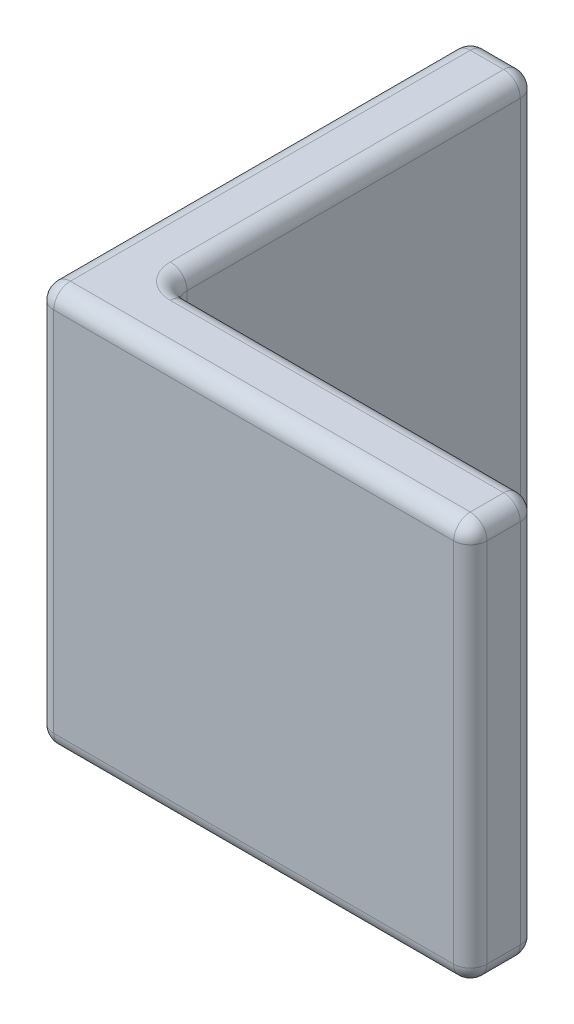
ISO-10303-21;
HEADER;
FILE_DESCRIPTION(('STEP AP214'),'2;1');
FILE_NAME('part.step','',(''),(''),'','','');
FILE_SCHEMA(('AUTOMOTIVE_DESIGN { 1 0 10303 214 1 1 1 1 }'));
ENDSEC;
DATA;
#1=APPLICATION_CONTEXT('core data for automotive mechanical design processes');
#2=APPLICATION_PROTOCOL_DEFINITION('international standard','automotive_design',2000,#1);
#3=PRODUCT_CONTEXT('',#1,'mechanical');
#4=PRODUCT('Part','Part','',(#3));
#5=PRODUCT_RELATED_PRODUCT_CATEGORY('part','',(#4));
#6=PRODUCT_DEFINITION_FORMATION('','',#4);
#7=PRODUCT_DEFINITION_CONTEXT('part definition',#1,'design');
#8=PRODUCT_DEFINITION('design','',#6,#7);
#9=PRODUCT_DEFINITION_SHAPE('','',#8);
#10=(LENGTH_UNIT() NAMED_UNIT(*) SI_UNIT(.MILLI.,.METRE.));
#11=(NAMED_UNIT(*) PLANE_ANGLE_UNIT() SI_UNIT($,.RADIAN.));
#12=(NAMED_UNIT(*) SI_UNIT($,.STERADIAN.) SOLID_ANGLE_UNIT());
#13=UNCERTAINTY_MEASURE_WITH_UNIT(LENGTH_MEASURE(1.E-05),#10,'distance_accuracy_value','');
#14=(GEOMETRIC_REPRESENTATION_CONTEXT(3) GLOBAL_UNCERTAINTY_ASSIGNED_CONTEXT((#13)) GLOBAL_UNIT_ASSIGNED_CONTEXT((#10,
#11,#12)) REPRESENTATION_CONTEXT('',''));
#15=CARTESIAN_POINT('',(0.,0.,0.));
#16=DIRECTION('',(0.,0.,1.));
#17=DIRECTION('',(1.,0.,0.));
#18=AXIS2_PLACEMENT_3D('',#15,#16,#17);
#19=CARTESIAN_POINT('',(0.,1828.8,0.));
#20=DIRECTION('',(1.,0.,0.));
#21=DIRECTION('',(0.,0.,-1.));
#22=AXIS2_PLACEMENT_3D('',#19,#20,#21);
#23=PLANE('',#22);
#24=DIRECTION('',(0.,-1.,0.));
#25=VECTOR('',#24,1.);
#26=CARTESIAN_POINT('',(0.,1828.8,-1905.));
#27=LINE('',#26,#25);
#28=CARTESIAN_POINT('',(0.,1752.6,-1905.));
#29=VERTEX_POINT('',#28);
#30=CARTESIAN_POINT('',(0.,76.2,-1905.));
#31=VERTEX_POINT('',#30);
#32=EDGE_CURVE('E178',#29,#31,#27,.T.);
#33=ORIENTED_EDGE('',*,*,#32,.T.);
#34=DIRECTION('',(0.,0.,1.));
#35=VECTOR('',#34,1.);
#36=CARTESIAN_POINT('',(0.,76.2,0.));
#37=LINE('',#36,#35);
#38=CARTESIAN_POINT('',(0.,76.2,-76.2));
#39=VERTEX_POINT('',#38);
#40=EDGE_CURVE('E174',#31,#39,#37,.T.);
#41=ORIENTED_EDGE('',*,*,#40,.T.);
#42=DIRECTION('',(0.,-1.,0.));
#43=VECTOR('',#42,1.);
#44=CARTESIAN_POINT('',(0.,1828.8,-76.2));
#45=LINE('',#44,#43);
#46=CARTESIAN_POINT('',(0.,1752.6,-76.2));
#47=VERTEX_POINT('',#46);
#48=EDGE_CURVE('E169',#39,#47,#45,.F.);
#49=ORIENTED_EDGE('',*,*,#48,.T.);
#50=DIRECTION('',(0.,0.,1.));
#51=VECTOR('',#50,1.);
#52=CARTESIAN_POINT('',(0.,1752.6,0.));
#53=LINE('',#52,#51);
#54=EDGE_CURVE('E171',#47,#29,#53,.F.);
#55=ORIENTED_EDGE('',*,*,#54,.T.);
#56=EDGE_LOOP('',(#33,#41,#49,#55));
#57=FACE_BOUND('',#56,.T.);
#58=ADVANCED_FACE('F39',(#57),#23,.F.);
#59=CARTESIAN_POINT('',(0.,1828.8,0.));
#60=DIRECTION('',(0.,0.,-1.));
#61=DIRECTION('',(-1.,0.,0.));
#62=AXIS2_PLACEMENT_3D('',#59,#60,#61);
#63=PLANE('',#62);
#64=DIRECTION('',(0.,-1.,0.));
#65=VECTOR('',#64,1.);
#66=CARTESIAN_POINT('',(76.2,1828.8,0.));
#67=LINE('',#66,#65);
#68=CARTESIAN_POINT('',(76.2,1752.6,0.));
#69=VERTEX_POINT('',#68);
#70=CARTESIAN_POINT('',(76.2,76.2,0.));
#71=VERTEX_POINT('',#70);
#72=EDGE_CURVE('E200',#69,#71,#67,.T.);
#73=ORIENTED_EDGE('',*,*,#72,.T.);
#74=DIRECTION('',(1.,0.,0.));
#75=VECTOR('',#74,1.);
#76=CARTESIAN_POINT('',(1981.2,76.2,0.));
#77=LINE('',#76,#75);
#78=CARTESIAN_POINT('',(1905.,76.2,0.));
#79=VERTEX_POINT('',#78);
#80=EDGE_CURVE('E322',#71,#79,#77,.T.);
#81=ORIENTED_EDGE('',*,*,#80,.T.);
#82=DIRECTION('',(0.,-1.,0.));
#83=VECTOR('',#82,1.);
#84=CARTESIAN_POINT('',(1905.,1828.8,0.));
#85=LINE('',#84,#83);
#86=CARTESIAN_POINT('',(1905.,1752.6,0.));
#87=VERTEX_POINT('',#86);
#88=EDGE_CURVE('E319',#79,#87,#85,.F.);
#89=ORIENTED_EDGE('',*,*,#88,.T.);
#90=DIRECTION('',(1.,0.,0.));
#91=VECTOR('',#90,1.);
#92=CARTESIAN_POINT('',(0.,1752.6,0.));
#93=LINE('',#92,#91);
#94=EDGE_CURVE('E317',#87,#69,#93,.F.);
#95=ORIENTED_EDGE('',*,*,#94,.T.);
#96=EDGE_LOOP('',(#73,#81,#89,#95));
#97=FACE_BOUND('',#96,.T.);
#98=ADVANCED_FACE('F452',(#97),#63,.F.);
#99=CARTESIAN_POINT('',(1981.2,1828.8,0.));
#100=DIRECTION('',(-1.,0.,0.));
#101=DIRECTION('',(0.,0.,1.));
#102=AXIS2_PLACEMENT_3D('',#99,#100,#101);
#103=PLANE('',#102);
#104=DIRECTION('',(0.,0.,-1.));
#105=VECTOR('',#104,1.);
#106=CARTESIAN_POINT('',(1981.2,76.2,-304.8));
#107=LINE('',#106,#105);
#108=CARTESIAN_POINT('',(1981.2,76.2,-76.2));
#109=VERTEX_POINT('',#108);
#110=CARTESIAN_POINT('',(1981.2,76.2,-228.6));
#111=VERTEX_POINT('',#110);
#112=EDGE_CURVE('E312',#109,#111,#107,.T.);
#113=ORIENTED_EDGE('',*,*,#112,.T.);
#114=DIRECTION('',(0.,-1.,0.));
#115=VECTOR('',#114,1.);
#116=CARTESIAN_POINT('',(1981.2,1828.8,-228.6));
#117=LINE('',#116,#115);
#118=CARTESIAN_POINT('',(1981.2,1752.6,-228.6));
#119=VERTEX_POINT('',#118);
#120=EDGE_CURVE('E314',#111,#119,#117,.F.);
#121=ORIENTED_EDGE('',*,*,#120,.T.);
#122=DIRECTION('',(0.,0.,-1.));
#123=VECTOR('',#122,1.);
#124=CARTESIAN_POINT('',(1981.2,1752.6,0.));
#125=LINE('',#124,#123);
#126=CARTESIAN_POINT('',(1981.2,1752.6,-76.2));
#127=VERTEX_POINT('',#126);
#128=EDGE_CURVE('E304',#119,#127,#125,.F.);
#129=ORIENTED_EDGE('',*,*,#128,.T.);
#130=DIRECTION('',(0.,-1.,0.));
#131=VECTOR('',#130,1.);
#132=CARTESIAN_POINT('',(1981.2,1828.8,-76.2));
#133=LINE('',#132,#131);
#134=EDGE_CURVE('E306',#127,#109,#133,.T.);
#135=ORIENTED_EDGE('',*,*,#134,.T.);
#136=EDGE_LOOP('',(#113,#121,#129,#135));
#137=FACE_BOUND('',#136,.T.);
#138=ADVANCED_FACE('F457',(#137),#103,.F.);
#139=CARTESIAN_POINT('',(304.8,1828.8,-304.8));
#140=DIRECTION('',(0.,0.,1.));
#141=DIRECTION('',(1.,0.,0.));
#142=AXIS2_PLACEMENT_3D('',#139,#140,#141);
#143=PLANE('',#142);
#144=DIRECTION('',(-1.,0.,0.));
#145=VECTOR('',#144,1.);
#146=CARTESIAN_POINT('',(304.8,76.2,-304.8));
#147=LINE('',#146,#145);
#148=CARTESIAN_POINT('',(1905.,76.2,-304.8));
#149=VERTEX_POINT('',#148);
#150=CARTESIAN_POINT('',(381.,76.2,-304.8));
#151=VERTEX_POINT('',#150);
#152=EDGE_CURVE('E300',#149,#151,#147,.T.);
#153=ORIENTED_EDGE('',*,*,#152,.T.);
#154=DIRECTION('',(0.,-1.,0.));
#155=VECTOR('',#154,1.);
#156=CARTESIAN_POINT('',(381.,1828.8,-304.8));
#157=LINE('',#156,#155);
#158=CARTESIAN_POINT('',(381.,1752.6,-304.8));
#159=VERTEX_POINT('',#158);
#160=EDGE_CURVE('E297',#151,#159,#157,.F.);
#161=ORIENTED_EDGE('',*,*,#160,.T.);
#162=DIRECTION('',(-1.,0.,0.));
#163=VECTOR('',#162,1.);
#164=CARTESIAN_POINT('',(304.8,1752.6,-304.8));
#165=LINE('',#164,#163);
#166=CARTESIAN_POINT('',(1905.,1752.6,-304.8));
#167=VERTEX_POINT('',#166);
#168=EDGE_CURVE('E290',#159,#167,#165,.F.);
#169=ORIENTED_EDGE('',*,*,#168,.T.);
#170=DIRECTION('',(0.,-1.,0.));
#171=VECTOR('',#170,1.);
#172=CARTESIAN_POINT('',(1905.,1828.8,-304.8));
#173=LINE('',#172,#171);
#174=EDGE_CURVE('E293',#167,#149,#173,.T.);
#175=ORIENTED_EDGE('',*,*,#174,.T.);
#176=EDGE_LOOP('',(#153,#161,#169,#175));
#177=FACE_BOUND('',#176,.T.);
#178=ADVANCED_FACE('F298',(#177),#143,.F.);
#179=CARTESIAN_POINT('',(304.8,1828.8,-1981.2));
#180=DIRECTION('',(-1.,0.,0.));
#181=DIRECTION('',(0.,0.,1.));
#182=AXIS2_PLACEMENT_3D('',#179,#180,#181);
#183=PLANE('',#182);
#184=DIRECTION('',(0.,0.,-1.));
#185=VECTOR('',#184,1.);
#186=CARTESIAN_POINT('',(304.8,76.2,-1981.2));
#187=LINE('',#186,#185);
#188=CARTESIAN_POINT('',(304.8,76.2,-381.));
#189=VERTEX_POINT('',#188);
#190=CARTESIAN_POINT('',(304.8,76.2,-1905.));
#191=VERTEX_POINT('',#190);
#192=EDGE_CURVE('E387',#189,#191,#187,.T.);
#193=ORIENTED_EDGE('',*,*,#192,.T.);
#194=DIRECTION('',(0.,-1.,0.));
#195=VECTOR('',#194,1.);
#196=CARTESIAN_POINT('',(304.8,1828.8,-1905.));
#197=LINE('',#196,#195);
#198=CARTESIAN_POINT('',(304.8,1752.6,-1905.));
#199=VERTEX_POINT('',#198);
#200=EDGE_CURVE('E294',#191,#199,#197,.F.);
#201=ORIENTED_EDGE('',*,*,#200,.T.);
#202=DIRECTION('',(0.,0.,-1.));
#203=VECTOR('',#202,1.);
#204=CARTESIAN_POINT('',(304.8,1752.6,-1981.2));
#205=LINE('',#204,#203);
#206=CARTESIAN_POINT('',(304.8,1752.6,-381.));
#207=VERTEX_POINT('',#206);
#208=EDGE_CURVE('E383',#199,#207,#205,.F.);
#209=ORIENTED_EDGE('',*,*,#208,.T.);
#210=DIRECTION('',(0.,-1.,0.));
#211=VECTOR('',#210,1.);
#212=CARTESIAN_POINT('',(304.8,0.,-381.));
#213=LINE('',#212,#211);
#214=EDGE_CURVE('E385',#207,#189,#213,.T.);
#215=ORIENTED_EDGE('',*,*,#214,.T.);
#216=EDGE_LOOP('',(#193,#201,#209,#215));
#217=FACE_BOUND('',#216,.T.);
#218=ADVANCED_FACE('F426',(#217),#183,.F.);
#219=CARTESIAN_POINT('',(0.,1828.8,-1981.2));
#220=DIRECTION('',(0.,0.,1.));
#221=DIRECTION('',(1.,0.,0.));
#222=AXIS2_PLACEMENT_3D('',#219,#220,#221);
#223=PLANE('',#222);
#224=DIRECTION('',(-1.,0.,0.));
#225=VECTOR('',#224,1.);
#226=CARTESIAN_POINT('',(0.,76.2,-1981.2));
#227=LINE('',#226,#225);
#228=CARTESIAN_POINT('',(228.6,76.2,-1981.2));
#229=VERTEX_POINT('',#228);
#230=CARTESIAN_POINT('',(76.2,76.2,-1981.2));
#231=VERTEX_POINT('',#230);
#232=EDGE_CURVE('E378',#229,#231,#227,.T.);
#233=ORIENTED_EDGE('',*,*,#232,.T.);
#234=DIRECTION('',(0.,-1.,0.));
#235=VECTOR('',#234,1.);
#236=CARTESIAN_POINT('',(76.2,1828.8,-1981.2));
#237=LINE('',#236,#235);
#238=CARTESIAN_POINT('',(76.2,1752.6,-1981.2));
#239=VERTEX_POINT('',#238);
#240=EDGE_CURVE('E380',#231,#239,#237,.F.);
#241=ORIENTED_EDGE('',*,*,#240,.T.);
#242=DIRECTION('',(-1.,0.,0.));
#243=VECTOR('',#242,1.);
#244=CARTESIAN_POINT('',(0.,1752.6,-1981.2));
#245=LINE('',#244,#243);
#246=CARTESIAN_POINT('',(228.6,1752.6,-1981.2));
#247=VERTEX_POINT('',#246);
#248=EDGE_CURVE('E371',#239,#247,#245,.F.);
#249=ORIENTED_EDGE('',*,*,#248,.T.);
#250=DIRECTION('',(0.,-1.,0.));
#251=VECTOR('',#250,1.);
#252=CARTESIAN_POINT('',(228.6,1828.8,-1981.2));
#253=LINE('',#252,#251);
#254=EDGE_CURVE('E373',#247,#229,#253,.T.);
#255=ORIENTED_EDGE('',*,*,#254,.T.);
#256=EDGE_LOOP('',(#233,#241,#249,#255));
#257=FACE_BOUND('',#256,.T.);
#258=ADVANCED_FACE('F722',(#257),#223,.F.);
#259=CARTESIAN_POINT('',(0.,1828.8,0.));
#260=DIRECTION('',(0.,-1.,0.));
#261=DIRECTION('',(0.,0.,-1.));
#262=AXIS2_PLACEMENT_3D('',#259,#260,#261);
#263=PLANE('',#262);
#264=CARTESIAN_POINT('',(381.,1828.8,-381.));
#265=DIRECTION('',(0.,-1.,0.));
#266=DIRECTION('',(0.,0.,-1.));
#267=AXIS2_PLACEMENT_3D('',#264,#265,#266);
#268=CIRCLE('',#267,152.4);
#269=CARTESIAN_POINT('',(228.6,1828.8,-381.));
#270=VERTEX_POINT('',#269);
#271=CARTESIAN_POINT('',(381.,1828.8,-228.6));
#272=VERTEX_POINT('',#271);
#273=EDGE_CURVE('E48',#270,#272,#268,.F.);
#274=ORIENTED_EDGE('',*,*,#273,.F.);
#275=DIRECTION('',(0.,0.,-1.));
#276=VECTOR('',#275,1.);
#277=CARTESIAN_POINT('',(228.6,1828.8,0.));
#278=LINE('',#277,#276);
#279=CARTESIAN_POINT('',(228.6,1828.8,-1905.));
#280=VERTEX_POINT('',#279);
#281=EDGE_CURVE('E11',#270,#280,#278,.T.);
#282=ORIENTED_EDGE('',*,*,#281,.T.);
#283=DIRECTION('',(-1.,0.,0.));
#284=VECTOR('',#283,1.);
#285=CARTESIAN_POINT('',(0.,1828.8,-1905.));
#286=LINE('',#285,#284);
#287=CARTESIAN_POINT('',(76.2,1828.8,-1905.));
#288=VERTEX_POINT('',#287);
#289=EDGE_CURVE('E332',#280,#288,#286,.T.);
#290=ORIENTED_EDGE('',*,*,#289,.T.);
#291=DIRECTION('',(0.,0.,1.));
#292=VECTOR('',#291,1.);
#293=CARTESIAN_POINT('',(76.2,1828.8,0.));
#294=LINE('',#293,#292);
#295=CARTESIAN_POINT('',(76.2,1828.8,-76.2));
#296=VERTEX_POINT('',#295);
#297=EDGE_CURVE('E324',#288,#296,#294,.T.);
#298=ORIENTED_EDGE('',*,*,#297,.T.);
#299=DIRECTION('',(1.,0.,0.));
#300=VECTOR('',#299,1.);
#301=CARTESIAN_POINT('',(0.,1828.8,-76.2));
#302=LINE('',#301,#300);
#303=CARTESIAN_POINT('',(1905.,1828.8,-76.2));
#304=VERTEX_POINT('',#303);
#305=EDGE_CURVE('E326',#296,#304,#302,.T.);
#306=ORIENTED_EDGE('',*,*,#305,.T.);
#307=DIRECTION('',(0.,0.,-1.));
#308=VECTOR('',#307,1.);
#309=CARTESIAN_POINT('',(1905.,1828.8,0.));
#310=LINE('',#309,#308);
#311=CARTESIAN_POINT('',(1905.,1828.8,-228.6));
#312=VERTEX_POINT('',#311);
#313=EDGE_CURVE('E328',#304,#312,#310,.T.);
#314=ORIENTED_EDGE('',*,*,#313,.T.);
#315=DIRECTION('',(-1.,0.,0.));
#316=VECTOR('',#315,1.);
#317=CARTESIAN_POINT('',(0.,1828.8,-228.6));
#318=LINE('',#317,#316);
#319=EDGE_CURVE('E330',#312,#272,#318,.T.);
#320=ORIENTED_EDGE('',*,*,#319,.T.);
#321=EDGE_LOOP('',(#274,#282,#290,#298,#306,#314,#320));
#322=FACE_BOUND('',#321,.T.);
#323=ADVANCED_FACE('F714',(#322),#263,.F.);
#324=CARTESIAN_POINT('',(0.,0.,0.));
#325=DIRECTION('',(0.,-1.,0.));
#326=DIRECTION('',(0.,0.,-1.));
#327=AXIS2_PLACEMENT_3D('',#324,#325,#326);
#328=PLANE('',#327);
#329=DIRECTION('',(1.,0.,0.));
#330=VECTOR('',#329,1.);
#331=CARTESIAN_POINT('',(0.,0.,-76.2));
#332=LINE('',#331,#330);
#333=CARTESIAN_POINT('',(1905.,0.,-76.2));
#334=VERTEX_POINT('',#333);
#335=CARTESIAN_POINT('',(76.2,0.,-76.2));
#336=VERTEX_POINT('',#335);
#337=EDGE_CURVE('E367',#334,#336,#332,.F.);
#338=ORIENTED_EDGE('',*,*,#337,.T.);
#339=DIRECTION('',(0.,0.,1.));
#340=VECTOR('',#339,1.);
#341=CARTESIAN_POINT('',(76.2,0.,-1981.2));
#342=LINE('',#341,#340);
#343=CARTESIAN_POINT('',(76.2,0.,-1905.));
#344=VERTEX_POINT('',#343);
#345=EDGE_CURVE('E361',#336,#344,#342,.F.);
#346=ORIENTED_EDGE('',*,*,#345,.T.);
#347=DIRECTION('',(-1.,0.,0.));
#348=VECTOR('',#347,1.);
#349=CARTESIAN_POINT('',(304.8,0.,-1905.));
#350=LINE('',#349,#348);
#351=CARTESIAN_POINT('',(228.6,0.,-1905.));
#352=VERTEX_POINT('',#351);
#353=EDGE_CURVE('E355',#344,#352,#350,.F.);
#354=ORIENTED_EDGE('',*,*,#353,.T.);
#355=DIRECTION('',(0.,0.,-1.));
#356=VECTOR('',#355,1.);
#357=CARTESIAN_POINT('',(228.6,0.,-304.8));
#358=LINE('',#357,#356);
#359=CARTESIAN_POINT('',(228.6,0.,-381.));
#360=VERTEX_POINT('',#359);
#361=EDGE_CURVE('E362',#352,#360,#358,.F.);
#362=ORIENTED_EDGE('',*,*,#361,.T.);
#363=CARTESIAN_POINT('',(381.,0.,-381.));
#364=DIRECTION('',(0.,-1.,0.));
#365=DIRECTION('',(0.,0.,-1.));
#366=AXIS2_PLACEMENT_3D('',#363,#364,#365);
#367=CIRCLE('',#366,152.4);
#368=CARTESIAN_POINT('',(381.,0.,-228.6));
#369=VERTEX_POINT('',#368);
#370=EDGE_CURVE('E411',#369,#360,#367,.T.);
#371=ORIENTED_EDGE('',*,*,#370,.F.);
#372=DIRECTION('',(-1.,0.,0.));
#373=VECTOR('',#372,1.);
#374=CARTESIAN_POINT('',(1981.2,0.,-228.6));
#375=LINE('',#374,#373);
#376=CARTESIAN_POINT('',(1905.,0.,-228.6));
#377=VERTEX_POINT('',#376);
#378=EDGE_CURVE('E409',#369,#377,#375,.F.);
#379=ORIENTED_EDGE('',*,*,#378,.T.);
#380=DIRECTION('',(0.,0.,-1.));
#381=VECTOR('',#380,1.);
#382=CARTESIAN_POINT('',(1905.,0.,0.));
#383=LINE('',#382,#381);
#384=EDGE_CURVE('E406',#377,#334,#383,.F.);
#385=ORIENTED_EDGE('',*,*,#384,.T.);
#386=EDGE_LOOP('',(#338,#346,#354,#362,#371,#379,#385));
#387=FACE_BOUND('',#386,.T.);
#388=ADVANCED_FACE('F365',(#387),#328,.T.);
#389=CARTESIAN_POINT('',(0.,1752.6,-228.6));
#390=DIRECTION('',(-1.,0.,0.));
#391=DIRECTION('',(0.,0.,1.));
#392=AXIS2_PLACEMENT_3D('',#389,#390,#391);
#393=CYLINDRICAL_SURFACE('',#392,76.2);
#394=CARTESIAN_POINT('',(381.,1752.6,-228.6));
#395=DIRECTION('',(-1.,0.,0.));
#396=DIRECTION('',(0.,0.,1.));
#397=AXIS2_PLACEMENT_3D('',#394,#395,#396);
#398=CIRCLE('',#397,76.2);
#399=EDGE_CURVE('E43',#272,#159,#398,.T.);
#400=ORIENTED_EDGE('',*,*,#399,.F.);
#401=ORIENTED_EDGE('',*,*,#319,.F.);
#402=CARTESIAN_POINT('',(1905.,1752.6,-228.6));
#403=DIRECTION('',(1.,0.,0.));
#404=DIRECTION('',(0.,0.,-1.));
#405=AXIS2_PLACEMENT_3D('',#402,#403,#404);
#406=CIRCLE('',#405,76.2);
#407=EDGE_CURVE('E275',#167,#312,#406,.T.);
#408=ORIENTED_EDGE('',*,*,#407,.F.);
#409=ORIENTED_EDGE('',*,*,#168,.F.);
#410=EDGE_LOOP('',(#400,#401,#408,#409));
#411=FACE_BOUND('',#410,.T.);
#412=ADVANCED_FACE('F41',(#411),#393,.T.);
#413=CARTESIAN_POINT('',(381.,1752.6,-381.));
#414=DIRECTION('',(0.,-1.,0.));
#415=DIRECTION('',(0.,0.,-1.));
#416=AXIS2_PLACEMENT_3D('',#413,#414,#415);
#417=TOROIDAL_SURFACE('',#416,152.4,76.2);
#418=ORIENTED_EDGE('',*,*,#273,.T.);
#419=ORIENTED_EDGE('',*,*,#399,.T.);
#420=CARTESIAN_POINT('',(381.,1752.6,-381.));
#421=DIRECTION('',(0.,-1.,0.));
#422=DIRECTION('',(0.,0.,-1.));
#423=AXIS2_PLACEMENT_3D('',#420,#421,#422);
#424=CIRCLE('',#423,76.2);
#425=EDGE_CURVE('E274',#207,#159,#424,.F.);
#426=ORIENTED_EDGE('',*,*,#425,.F.);
#427=CARTESIAN_POINT('',(228.6,1752.6,-381.));
#428=DIRECTION('',(0.,0.,1.));
#429=DIRECTION('',(1.,0.,0.));
#430=AXIS2_PLACEMENT_3D('',#427,#428,#429);
#431=CIRCLE('',#430,76.2);
#432=EDGE_CURVE('E271',#270,#207,#431,.F.);
#433=ORIENTED_EDGE('',*,*,#432,.F.);
#434=EDGE_LOOP('',(#418,#419,#426,#433));
#435=FACE_BOUND('',#434,.T.);
#436=ADVANCED_FACE('F286',(#435),#417,.T.);
#437=CARTESIAN_POINT('',(1905.,1752.6,-228.6));
#438=DIRECTION('',(0.,0.,1.));
#439=DIRECTION('',(1.,0.,0.));
#440=AXIS2_PLACEMENT_3D('',#437,#438,#439);
#441=SPHERICAL_SURFACE('',#440,76.2);
#442=CARTESIAN_POINT('',(1905.,1752.6,-228.6));
#443=DIRECTION('',(0.,1.,0.));
#444=DIRECTION('',(0.,0.,1.));
#445=AXIS2_PLACEMENT_3D('',#442,#443,#444);
#446=CIRCLE('',#445,76.2);
#447=EDGE_CURVE('E265',#167,#119,#446,.F.);
#448=ORIENTED_EDGE('',*,*,#447,.F.);
#449=ORIENTED_EDGE('',*,*,#407,.T.);
#450=CARTESIAN_POINT('',(1905.,1752.6,-228.6));
#451=DIRECTION('',(0.,0.,-1.));
#452=DIRECTION('',(-1.,0.,0.));
#453=AXIS2_PLACEMENT_3D('',#450,#451,#452);
#454=CIRCLE('',#453,76.2);
#455=EDGE_CURVE('E268',#119,#312,#454,.F.);
#456=ORIENTED_EDGE('',*,*,#455,.F.);
#457=EDGE_LOOP('',(#448,#449,#456));
#458=FACE_BOUND('',#457,.T.);
#459=ADVANCED_FACE('F449',(#458),#441,.T.);
#460=CARTESIAN_POINT('',(381.,1828.8,-381.));
#461=DIRECTION('',(0.,1.,0.));
#462=DIRECTION('',(0.,0.,1.));
#463=AXIS2_PLACEMENT_3D('',#460,#461,#462);
#464=CYLINDRICAL_SURFACE('',#463,76.2);
#465=ORIENTED_EDGE('',*,*,#425,.T.);
#466=ORIENTED_EDGE('',*,*,#160,.F.);
#467=CARTESIAN_POINT('',(381.,76.2,-381.));
#468=DIRECTION('',(0.,-1.,0.));
#469=DIRECTION('',(0.,0.,-1.));
#470=AXIS2_PLACEMENT_3D('',#467,#468,#469);
#471=CIRCLE('',#470,76.2);
#472=EDGE_CURVE('E259',#189,#151,#471,.F.);
#473=ORIENTED_EDGE('',*,*,#472,.F.);
#474=ORIENTED_EDGE('',*,*,#214,.F.);
#475=EDGE_LOOP('',(#465,#466,#473,#474));
#476=FACE_BOUND('',#475,.T.);
#477=ADVANCED_FACE('F441',(#476),#464,.F.);
#478=CARTESIAN_POINT('',(228.6,1752.6,0.));
#479=DIRECTION('',(0.,0.,-1.));
#480=DIRECTION('',(-1.,0.,0.));
#481=AXIS2_PLACEMENT_3D('',#478,#479,#480);
#482=CYLINDRICAL_SURFACE('',#481,76.2);
#483=ORIENTED_EDGE('',*,*,#432,.T.);
#484=ORIENTED_EDGE('',*,*,#208,.F.);
#485=CARTESIAN_POINT('',(228.6,1752.6,-1905.));
#486=DIRECTION('',(0.,0.,-1.));
#487=DIRECTION('',(-1.,0.,0.));
#488=AXIS2_PLACEMENT_3D('',#485,#486,#487);
#489=CIRCLE('',#488,76.2);
#490=EDGE_CURVE('E256',#280,#199,#489,.T.);
#491=ORIENTED_EDGE('',*,*,#490,.F.);
#492=ORIENTED_EDGE('',*,*,#281,.F.);
#493=EDGE_LOOP('',(#483,#484,#491,#492));
#494=FACE_BOUND('',#493,.T.);
#495=ADVANCED_FACE('F438',(#494),#482,.T.);
#496=CARTESIAN_POINT('',(1905.,1752.6,0.));
#497=DIRECTION('',(0.,0.,-1.));
#498=DIRECTION('',(-1.,0.,0.));
#499=AXIS2_PLACEMENT_3D('',#496,#497,#498);
#500=CYLINDRICAL_SURFACE('',#499,76.2);
#501=ORIENTED_EDGE('',*,*,#455,.T.);
#502=ORIENTED_EDGE('',*,*,#313,.F.);
#503=CARTESIAN_POINT('',(1905.,1752.6,-76.2));
#504=DIRECTION('',(0.,0.,1.));
#505=DIRECTION('',(1.,0.,0.));
#506=AXIS2_PLACEMENT_3D('',#503,#504,#505);
#507=CIRCLE('',#506,76.2);
#508=EDGE_CURVE('E253',#127,#304,#507,.T.);
#509=ORIENTED_EDGE('',*,*,#508,.F.);
#510=ORIENTED_EDGE('',*,*,#128,.F.);
#511=EDGE_LOOP('',(#501,#502,#509,#510));
#512=FACE_BOUND('',#511,.T.);
#513=ADVANCED_FACE('F440',(#512),#500,.T.);
#514=CARTESIAN_POINT('',(1905.,1828.8,-228.6));
#515=DIRECTION('',(0.,-1.,0.));
#516=DIRECTION('',(0.,0.,-1.));
#517=AXIS2_PLACEMENT_3D('',#514,#515,#516);
#518=CYLINDRICAL_SURFACE('',#517,76.2);
#519=ORIENTED_EDGE('',*,*,#447,.T.);
#520=ORIENTED_EDGE('',*,*,#120,.F.);
#521=CARTESIAN_POINT('',(1905.,76.2,-228.6));
#522=DIRECTION('',(0.,-1.,0.));
#523=DIRECTION('',(0.,0.,-1.));
#524=AXIS2_PLACEMENT_3D('',#521,#522,#523);
#525=CIRCLE('',#524,76.2);
#526=EDGE_CURVE('E250',#149,#111,#525,.T.);
#527=ORIENTED_EDGE('',*,*,#526,.F.);
#528=ORIENTED_EDGE('',*,*,#174,.F.);
#529=EDGE_LOOP('',(#519,#520,#527,#528));
#530=FACE_BOUND('',#529,.T.);
#531=ADVANCED_FACE('F399',(#530),#518,.T.);
#532=CARTESIAN_POINT('',(304.8,76.2,-228.6));
#533=DIRECTION('',(1.,0.,0.));
#534=DIRECTION('',(0.,0.,-1.));
#535=AXIS2_PLACEMENT_3D('',#532,#533,#534);
#536=CYLINDRICAL_SURFACE('',#535,76.2);
#537=CARTESIAN_POINT('',(1905.,76.2,-228.6));
#538=DIRECTION('',(1.,0.,0.));
#539=DIRECTION('',(0.,0.,-1.));
#540=AXIS2_PLACEMENT_3D('',#537,#538,#539);
#541=CIRCLE('',#540,76.2);
#542=EDGE_CURVE('E247',#377,#149,#541,.T.);
#543=ORIENTED_EDGE('',*,*,#542,.F.);
#544=ORIENTED_EDGE('',*,*,#378,.F.);
#545=CARTESIAN_POINT('',(381.,76.2,-228.6));
#546=DIRECTION('',(-1.,0.,0.));
#547=DIRECTION('',(0.,0.,1.));
#548=AXIS2_PLACEMENT_3D('',#545,#546,#547);
#549=CIRCLE('',#548,76.2);
#550=EDGE_CURVE('E262',#151,#369,#549,.T.);
#551=ORIENTED_EDGE('',*,*,#550,.F.);
#552=ORIENTED_EDGE('',*,*,#152,.F.);
#553=EDGE_LOOP('',(#543,#544,#551,#552));
#554=FACE_BOUND('',#553,.T.);
#555=ADVANCED_FACE('F395',(#554),#536,.T.);
#556=CARTESIAN_POINT('',(381.,76.2,-381.));
#557=DIRECTION('',(0.,-1.,0.));
#558=DIRECTION('',(0.,0.,-1.));
#559=AXIS2_PLACEMENT_3D('',#556,#557,#558);
#560=TOROIDAL_SURFACE('',#559,152.4,76.2);
#561=ORIENTED_EDGE('',*,*,#550,.T.);
#562=ORIENTED_EDGE('',*,*,#370,.T.);
#563=CARTESIAN_POINT('',(228.6,76.2,-381.));
#564=DIRECTION('',(0.,0.,1.));
#565=DIRECTION('',(1.,0.,0.));
#566=AXIS2_PLACEMENT_3D('',#563,#564,#565);
#567=CIRCLE('',#566,76.2);
#568=EDGE_CURVE('E244',#189,#360,#567,.F.);
#569=ORIENTED_EDGE('',*,*,#568,.F.);
#570=ORIENTED_EDGE('',*,*,#472,.T.);
#571=EDGE_LOOP('',(#561,#562,#569,#570));
#572=FACE_BOUND('',#571,.T.);
#573=ADVANCED_FACE('F421',(#572),#560,.T.);
#574=CARTESIAN_POINT('',(228.6,1752.6,-1905.));
#575=DIRECTION('',(0.,0.,1.));
#576=DIRECTION('',(1.,0.,0.));
#577=AXIS2_PLACEMENT_3D('',#574,#575,#576);
#578=SPHERICAL_SURFACE('',#577,76.2);
#579=CARTESIAN_POINT('',(228.6,1752.6,-1905.));
#580=DIRECTION('',(1.,0.,0.));
#581=DIRECTION('',(0.,0.,-1.));
#582=AXIS2_PLACEMENT_3D('',#579,#580,#581);
#583=CIRCLE('',#582,76.2);
#584=EDGE_CURVE('E239',#280,#247,#583,.F.);
#585=ORIENTED_EDGE('',*,*,#584,.F.);
#586=ORIENTED_EDGE('',*,*,#490,.T.);
#587=CARTESIAN_POINT('',(228.6,1752.6,-1905.));
#588=DIRECTION('',(0.,1.,0.));
#589=DIRECTION('',(0.,0.,1.));
#590=AXIS2_PLACEMENT_3D('',#587,#588,#589);
#591=CIRCLE('',#590,76.2);
#592=EDGE_CURVE('E242',#247,#199,#591,.F.);
#593=ORIENTED_EDGE('',*,*,#592,.F.);
#594=EDGE_LOOP('',(#585,#586,#593));
#595=FACE_BOUND('',#594,.T.);
#596=ADVANCED_FACE('F435',(#595),#578,.T.);
#597=CARTESIAN_POINT('',(1905.,1752.6,-76.2));
#598=DIRECTION('',(0.,0.,1.));
#599=DIRECTION('',(1.,0.,0.));
#600=AXIS2_PLACEMENT_3D('',#597,#598,#599);
#601=SPHERICAL_SURFACE('',#600,76.2);
#602=CARTESIAN_POINT('',(1905.,1752.6,-76.2));
#603=DIRECTION('',(0.,1.,0.));
#604=DIRECTION('',(0.,0.,1.));
#605=AXIS2_PLACEMENT_3D('',#602,#603,#604);
#606=CIRCLE('',#605,76.2);
#607=EDGE_CURVE('E233',#127,#87,#606,.F.);
#608=ORIENTED_EDGE('',*,*,#607,.F.);
#609=ORIENTED_EDGE('',*,*,#508,.T.);
#610=CARTESIAN_POINT('',(1905.,1752.6,-76.2));
#611=DIRECTION('',(1.,0.,0.));
#612=DIRECTION('',(0.,0.,-1.));
#613=AXIS2_PLACEMENT_3D('',#610,#611,#612);
#614=CIRCLE('',#613,76.2);
#615=EDGE_CURVE('E236',#87,#304,#614,.F.);
#616=ORIENTED_EDGE('',*,*,#615,.F.);
#617=EDGE_LOOP('',(#608,#609,#616));
#618=FACE_BOUND('',#617,.T.);
#619=ADVANCED_FACE('F519',(#618),#601,.T.);
#620=CARTESIAN_POINT('',(1905.,76.2,-228.6));
#621=DIRECTION('',(0.,0.,1.));
#622=DIRECTION('',(1.,0.,0.));
#623=AXIS2_PLACEMENT_3D('',#620,#621,#622);
#624=SPHERICAL_SURFACE('',#623,76.2);
#625=ORIENTED_EDGE('',*,*,#542,.T.);
#626=ORIENTED_EDGE('',*,*,#526,.T.);
#627=CARTESIAN_POINT('',(1905.,76.2,-228.6));
#628=DIRECTION('',(0.,0.,-1.));
#629=DIRECTION('',(-1.,0.,0.));
#630=AXIS2_PLACEMENT_3D('',#627,#628,#629);
#631=CIRCLE('',#630,76.2);
#632=EDGE_CURVE('E230',#377,#111,#631,.F.);
#633=ORIENTED_EDGE('',*,*,#632,.F.);
#634=EDGE_LOOP('',(#625,#626,#633));
#635=FACE_BOUND('',#634,.T.);
#636=ADVANCED_FACE('F401',(#635),#624,.T.);
#637=CARTESIAN_POINT('',(228.6,76.2,-1981.2));
#638=DIRECTION('',(0.,0.,1.));
#639=DIRECTION('',(1.,0.,0.));
#640=AXIS2_PLACEMENT_3D('',#637,#638,#639);
#641=CYLINDRICAL_SURFACE('',#640,76.2);
#642=ORIENTED_EDGE('',*,*,#568,.T.);
#643=ORIENTED_EDGE('',*,*,#361,.F.);
#644=CARTESIAN_POINT('',(228.6,76.2,-1905.));
#645=DIRECTION('',(0.,0.,-1.));
#646=DIRECTION('',(-1.,0.,0.));
#647=AXIS2_PLACEMENT_3D('',#644,#645,#646);
#648=CIRCLE('',#647,76.2);
#649=EDGE_CURVE('E227',#191,#352,#648,.T.);
#650=ORIENTED_EDGE('',*,*,#649,.F.);
#651=ORIENTED_EDGE('',*,*,#192,.F.);
#652=EDGE_LOOP('',(#642,#643,#650,#651));
#653=FACE_BOUND('',#652,.T.);
#654=ADVANCED_FACE('F423',(#653),#641,.T.);
#655=CARTESIAN_POINT('',(228.6,1828.8,-1905.));
#656=DIRECTION('',(0.,-1.,0.));
#657=DIRECTION('',(0.,0.,-1.));
#658=AXIS2_PLACEMENT_3D('',#655,#656,#657);
#659=CYLINDRICAL_SURFACE('',#658,76.2);
#660=ORIENTED_EDGE('',*,*,#592,.T.);
#661=ORIENTED_EDGE('',*,*,#200,.F.);
#662=CARTESIAN_POINT('',(228.6,76.2,-1905.));
#663=DIRECTION('',(0.,-1.,0.));
#664=DIRECTION('',(0.,0.,-1.));
#665=AXIS2_PLACEMENT_3D('',#662,#663,#664);
#666=CIRCLE('',#665,76.2);
#667=EDGE_CURVE('E224',#229,#191,#666,.T.);
#668=ORIENTED_EDGE('',*,*,#667,.F.);
#669=ORIENTED_EDGE('',*,*,#254,.F.);
#670=EDGE_LOOP('',(#660,#661,#668,#669));
#671=FACE_BOUND('',#670,.T.);
#672=ADVANCED_FACE('F429',(#671),#659,.T.);
#673=CARTESIAN_POINT('',(0.,1752.6,-1905.));
#674=DIRECTION('',(-1.,0.,0.));
#675=DIRECTION('',(0.,0.,1.));
#676=AXIS2_PLACEMENT_3D('',#673,#674,#675);
#677=CYLINDRICAL_SURFACE('',#676,76.2);
#678=ORIENTED_EDGE('',*,*,#584,.T.);
#679=ORIENTED_EDGE('',*,*,#248,.F.);
#680=CARTESIAN_POINT('',(76.2,1752.6,-1905.));
#681=DIRECTION('',(-1.,0.,0.));
#682=DIRECTION('',(0.,0.,1.));
#683=AXIS2_PLACEMENT_3D('',#680,#681,#682);
#684=CIRCLE('',#683,76.2);
#685=EDGE_CURVE('E221',#288,#239,#684,.T.);
#686=ORIENTED_EDGE('',*,*,#685,.F.);
#687=ORIENTED_EDGE('',*,*,#289,.F.);
#688=EDGE_LOOP('',(#678,#679,#686,#687));
#689=FACE_BOUND('',#688,.T.);
#690=ADVANCED_FACE('F509',(#689),#677,.T.);
#691=CARTESIAN_POINT('',(76.2,1752.6,0.));
#692=DIRECTION('',(0.,0.,1.));
#693=DIRECTION('',(1.,0.,0.));
#694=AXIS2_PLACEMENT_3D('',#691,#692,#693);
#695=CYLINDRICAL_SURFACE('',#694,76.2);
#696=CARTESIAN_POINT('',(76.2,1752.6,-76.2));
#697=DIRECTION('',(0.,0.,1.));
#698=DIRECTION('',(1.,0.,0.));
#699=AXIS2_PLACEMENT_3D('',#696,#697,#698);
#700=CIRCLE('',#699,76.2);
#701=EDGE_CURVE('E185',#296,#47,#700,.T.);
#702=ORIENTED_EDGE('',*,*,#701,.F.);
#703=ORIENTED_EDGE('',*,*,#297,.F.);
#704=CARTESIAN_POINT('',(76.2,1752.6,-1905.));
#705=DIRECTION('',(0.,0.,-1.));
#706=DIRECTION('',(-1.,0.,0.));
#707=AXIS2_PLACEMENT_3D('',#704,#705,#706);
#708=CIRCLE('',#707,76.2);
#709=EDGE_CURVE('E187',#29,#288,#708,.T.);
#710=ORIENTED_EDGE('',*,*,#709,.F.);
#711=ORIENTED_EDGE('',*,*,#54,.F.);
#712=EDGE_LOOP('',(#702,#703,#710,#711));
#713=FACE_BOUND('',#712,.T.);
#714=ADVANCED_FACE('F183',(#713),#695,.T.);
#715=CARTESIAN_POINT('',(0.,1752.6,-76.2));
#716=DIRECTION('',(1.,0.,0.));
#717=DIRECTION('',(0.,0.,-1.));
#718=AXIS2_PLACEMENT_3D('',#715,#716,#717);
#719=CYLINDRICAL_SURFACE('',#718,76.2);
#720=ORIENTED_EDGE('',*,*,#615,.T.);
#721=ORIENTED_EDGE('',*,*,#305,.F.);
#722=CARTESIAN_POINT('',(76.2,1752.6,-76.2));
#723=DIRECTION('',(-1.,0.,0.));
#724=DIRECTION('',(0.,-1.,0.));
#725=AXIS2_PLACEMENT_3D('',#722,#723,#724);
#726=CIRCLE('',#725,76.2);
#727=EDGE_CURVE('E196',#69,#296,#726,.T.);
#728=ORIENTED_EDGE('',*,*,#727,.F.);
#729=ORIENTED_EDGE('',*,*,#94,.F.);
#730=EDGE_LOOP('',(#720,#721,#728,#729));
#731=FACE_BOUND('',#730,.T.);
#732=ADVANCED_FACE('F502',(#731),#719,.T.);
#733=CARTESIAN_POINT('',(1905.,1828.8,-76.2));
#734=DIRECTION('',(0.,-1.,0.));
#735=DIRECTION('',(0.,0.,-1.));
#736=AXIS2_PLACEMENT_3D('',#733,#734,#735);
#737=CYLINDRICAL_SURFACE('',#736,76.2);
#738=ORIENTED_EDGE('',*,*,#607,.T.);
#739=ORIENTED_EDGE('',*,*,#88,.F.);
#740=CARTESIAN_POINT('',(1905.,76.2,-76.2));
#741=DIRECTION('',(0.,-1.,0.));
#742=DIRECTION('',(0.,0.,-1.));
#743=AXIS2_PLACEMENT_3D('',#740,#741,#742);
#744=CIRCLE('',#743,76.2);
#745=EDGE_CURVE('E216',#109,#79,#744,.T.);
#746=ORIENTED_EDGE('',*,*,#745,.F.);
#747=ORIENTED_EDGE('',*,*,#134,.F.);
#748=EDGE_LOOP('',(#738,#739,#746,#747));
#749=FACE_BOUND('',#748,.T.);
#750=ADVANCED_FACE('F499',(#749),#737,.T.);
#751=CARTESIAN_POINT('',(1905.,76.2,0.));
#752=DIRECTION('',(0.,0.,1.));
#753=DIRECTION('',(1.,0.,0.));
#754=AXIS2_PLACEMENT_3D('',#751,#752,#753);
#755=CYLINDRICAL_SURFACE('',#754,76.2);
#756=ORIENTED_EDGE('',*,*,#632,.T.);
#757=ORIENTED_EDGE('',*,*,#112,.F.);
#758=CARTESIAN_POINT('',(1905.,76.2,-76.2));
#759=DIRECTION('',(0.,0.,1.));
#760=DIRECTION('',(1.,0.,0.));
#761=AXIS2_PLACEMENT_3D('',#758,#759,#760);
#762=CIRCLE('',#761,76.2);
#763=EDGE_CURVE('E213',#334,#109,#762,.T.);
#764=ORIENTED_EDGE('',*,*,#763,.F.);
#765=ORIENTED_EDGE('',*,*,#384,.F.);
#766=EDGE_LOOP('',(#756,#757,#764,#765));
#767=FACE_BOUND('',#766,.T.);
#768=ADVANCED_FACE('F407',(#767),#755,.T.);
#769=CARTESIAN_POINT('',(228.6,76.2,-1905.));
#770=DIRECTION('',(0.,0.,1.));
#771=DIRECTION('',(1.,0.,0.));
#772=AXIS2_PLACEMENT_3D('',#769,#770,#771);
#773=SPHERICAL_SURFACE('',#772,76.2);
#774=ORIENTED_EDGE('',*,*,#667,.T.);
#775=ORIENTED_EDGE('',*,*,#649,.T.);
#776=CARTESIAN_POINT('',(228.6,76.2,-1905.));
#777=DIRECTION('',(1.,0.,0.));
#778=DIRECTION('',(0.,0.,-1.));
#779=AXIS2_PLACEMENT_3D('',#776,#777,#778);
#780=CIRCLE('',#779,76.2);
#781=EDGE_CURVE('E204',#229,#352,#780,.F.);
#782=ORIENTED_EDGE('',*,*,#781,.F.);
#783=EDGE_LOOP('',(#774,#775,#782));
#784=FACE_BOUND('',#783,.T.);
#785=ADVANCED_FACE('F492',(#784),#773,.T.);
#786=CARTESIAN_POINT('',(76.2,1752.6,-1905.));
#787=DIRECTION('',(0.,0.,1.));
#788=DIRECTION('',(1.,0.,0.));
#789=AXIS2_PLACEMENT_3D('',#786,#787,#788);
#790=SPHERICAL_SURFACE('',#789,76.2);
#791=ORIENTED_EDGE('',*,*,#709,.T.);
#792=ORIENTED_EDGE('',*,*,#685,.T.);
#793=CARTESIAN_POINT('',(76.2,1752.6,-1905.));
#794=DIRECTION('',(0.,1.,0.));
#795=DIRECTION('',(0.,0.,1.));
#796=AXIS2_PLACEMENT_3D('',#793,#794,#795);
#797=CIRCLE('',#796,76.2);
#798=EDGE_CURVE('E201',#29,#239,#797,.F.);
#799=ORIENTED_EDGE('',*,*,#798,.F.);
#800=EDGE_LOOP('',(#791,#792,#799));
#801=FACE_BOUND('',#800,.T.);
#802=ADVANCED_FACE('F489',(#801),#790,.T.);
#803=CARTESIAN_POINT('',(76.2,1752.6,-76.2));
#804=DIRECTION('',(0.,0.,1.));
#805=DIRECTION('',(1.,0.,0.));
#806=AXIS2_PLACEMENT_3D('',#803,#804,#805);
#807=SPHERICAL_SURFACE('',#806,76.2);
#808=ORIENTED_EDGE('',*,*,#727,.T.);
#809=ORIENTED_EDGE('',*,*,#701,.T.);
#810=CARTESIAN_POINT('',(76.2,1752.6,-76.2));
#811=DIRECTION('',(0.,1.,0.));
#812=DIRECTION('',(0.,0.,1.));
#813=AXIS2_PLACEMENT_3D('',#810,#811,#812);
#814=CIRCLE('',#813,76.2);
#815=EDGE_CURVE('E193',#69,#47,#814,.F.);
#816=ORIENTED_EDGE('',*,*,#815,.F.);
#817=EDGE_LOOP('',(#808,#809,#816));
#818=FACE_BOUND('',#817,.T.);
#819=ADVANCED_FACE('F192',(#818),#807,.T.);
#820=CARTESIAN_POINT('',(1905.,76.2,-76.2));
#821=DIRECTION('',(0.,0.,1.));
#822=DIRECTION('',(1.,0.,0.));
#823=AXIS2_PLACEMENT_3D('',#820,#821,#822);
#824=SPHERICAL_SURFACE('',#823,76.2);
#825=ORIENTED_EDGE('',*,*,#763,.T.);
#826=ORIENTED_EDGE('',*,*,#745,.T.);
#827=CARTESIAN_POINT('',(1905.,76.2,-76.2));
#828=DIRECTION('',(1.,0.,0.));
#829=DIRECTION('',(0.,0.,-1.));
#830=AXIS2_PLACEMENT_3D('',#827,#828,#829);
#831=CIRCLE('',#830,76.2);
#832=EDGE_CURVE('E202',#334,#79,#831,.F.);
#833=ORIENTED_EDGE('',*,*,#832,.F.);
#834=EDGE_LOOP('',(#825,#826,#833));
#835=FACE_BOUND('',#834,.T.);
#836=ADVANCED_FACE('F483',(#835),#824,.T.);
#837=CARTESIAN_POINT('',(0.,76.2,-1905.));
#838=DIRECTION('',(1.,0.,0.));
#839=DIRECTION('',(0.,0.,-1.));
#840=AXIS2_PLACEMENT_3D('',#837,#838,#839);
#841=CYLINDRICAL_SURFACE('',#840,76.2);
#842=ORIENTED_EDGE('',*,*,#781,.T.);
#843=ORIENTED_EDGE('',*,*,#353,.F.);
#844=CARTESIAN_POINT('',(76.2,76.2,-1905.));
#845=DIRECTION('',(-1.,0.,0.));
#846=DIRECTION('',(0.,0.,1.));
#847=AXIS2_PLACEMENT_3D('',#844,#845,#846);
#848=CIRCLE('',#847,76.2);
#849=EDGE_CURVE('E207',#231,#344,#848,.T.);
#850=ORIENTED_EDGE('',*,*,#849,.F.);
#851=ORIENTED_EDGE('',*,*,#232,.F.);
#852=EDGE_LOOP('',(#842,#843,#850,#851));
#853=FACE_BOUND('',#852,.T.);
#854=ADVANCED_FACE('F357',(#853),#841,.T.);
#855=CARTESIAN_POINT('',(76.2,1828.8,-1905.));
#856=DIRECTION('',(0.,-1.,0.));
#857=DIRECTION('',(0.,0.,-1.));
#858=AXIS2_PLACEMENT_3D('',#855,#856,#857);
#859=CYLINDRICAL_SURFACE('',#858,76.2);
#860=ORIENTED_EDGE('',*,*,#798,.T.);
#861=ORIENTED_EDGE('',*,*,#240,.F.);
#862=CARTESIAN_POINT('',(76.2,76.2,-1905.));
#863=DIRECTION('',(0.,-1.,0.));
#864=DIRECTION('',(0.,0.,-1.));
#865=AXIS2_PLACEMENT_3D('',#862,#863,#864);
#866=CIRCLE('',#865,76.2);
#867=EDGE_CURVE('E344',#31,#231,#866,.T.);
#868=ORIENTED_EDGE('',*,*,#867,.F.);
#869=ORIENTED_EDGE('',*,*,#32,.F.);
#870=EDGE_LOOP('',(#860,#861,#868,#869));
#871=FACE_BOUND('',#870,.T.);
#872=ADVANCED_FACE('F477',(#871),#859,.T.);
#873=CARTESIAN_POINT('',(76.2,1828.8,-76.2));
#874=DIRECTION('',(0.,-1.,0.));
#875=DIRECTION('',(0.,0.,-1.));
#876=AXIS2_PLACEMENT_3D('',#873,#874,#875);
#877=CYLINDRICAL_SURFACE('',#876,76.2);
#878=ORIENTED_EDGE('',*,*,#815,.T.);
#879=ORIENTED_EDGE('',*,*,#48,.F.);
#880=CARTESIAN_POINT('',(76.2,76.2,-76.2));
#881=DIRECTION('',(0.,-1.,0.));
#882=DIRECTION('',(0.,0.,-1.));
#883=AXIS2_PLACEMENT_3D('',#880,#881,#882);
#884=CIRCLE('',#883,76.2);
#885=EDGE_CURVE('E341',#71,#39,#884,.T.);
#886=ORIENTED_EDGE('',*,*,#885,.F.);
#887=ORIENTED_EDGE('',*,*,#72,.F.);
#888=EDGE_LOOP('',(#878,#879,#886,#887));
#889=FACE_BOUND('',#888,.T.);
#890=ADVANCED_FACE('F198',(#889),#877,.T.);
#891=CARTESIAN_POINT('',(0.,76.2,-76.2));
#892=DIRECTION('',(-1.,0.,0.));
#893=DIRECTION('',(0.,0.,1.));
#894=AXIS2_PLACEMENT_3D('',#891,#892,#893);
#895=CYLINDRICAL_SURFACE('',#894,76.2);
#896=ORIENTED_EDGE('',*,*,#832,.T.);
#897=ORIENTED_EDGE('',*,*,#80,.F.);
#898=CARTESIAN_POINT('',(76.2,76.2,-76.2));
#899=DIRECTION('',(-1.,0.,0.));
#900=DIRECTION('',(0.,0.,1.));
#901=AXIS2_PLACEMENT_3D('',#898,#899,#900);
#902=CIRCLE('',#901,76.2);
#903=EDGE_CURVE('E339',#336,#71,#902,.T.);
#904=ORIENTED_EDGE('',*,*,#903,.F.);
#905=ORIENTED_EDGE('',*,*,#337,.F.);
#906=EDGE_LOOP('',(#896,#897,#904,#905));
#907=FACE_BOUND('',#906,.T.);
#908=ADVANCED_FACE('F471',(#907),#895,.T.);
#909=CARTESIAN_POINT('',(76.2,76.2,-1905.));
#910=DIRECTION('',(0.,0.,1.));
#911=DIRECTION('',(1.,0.,0.));
#912=AXIS2_PLACEMENT_3D('',#909,#910,#911);
#913=SPHERICAL_SURFACE('',#912,76.2);
#914=ORIENTED_EDGE('',*,*,#867,.T.);
#915=ORIENTED_EDGE('',*,*,#849,.T.);
#916=CARTESIAN_POINT('',(76.2,76.2,-1905.));
#917=DIRECTION('',(0.,0.,-1.));
#918=DIRECTION('',(-1.,0.,0.));
#919=AXIS2_PLACEMENT_3D('',#916,#917,#918);
#920=CIRCLE('',#919,76.2);
#921=EDGE_CURVE('E337',#31,#344,#920,.F.);
#922=ORIENTED_EDGE('',*,*,#921,.F.);
#923=EDGE_LOOP('',(#914,#915,#922));
#924=FACE_BOUND('',#923,.T.);
#925=ADVANCED_FACE('F351',(#924),#913,.T.);
#926=CARTESIAN_POINT('',(76.2,76.2,-76.2));
#927=DIRECTION('',(0.,0.,1.));
#928=DIRECTION('',(1.,0.,0.));
#929=AXIS2_PLACEMENT_3D('',#926,#927,#928);
#930=SPHERICAL_SURFACE('',#929,76.2);
#931=ORIENTED_EDGE('',*,*,#903,.T.);
#932=ORIENTED_EDGE('',*,*,#885,.T.);
#933=CARTESIAN_POINT('',(76.2,76.2,-76.2));
#934=DIRECTION('',(0.,0.,1.));
#935=DIRECTION('',(1.,0.,0.));
#936=AXIS2_PLACEMENT_3D('',#933,#934,#935);
#937=CIRCLE('',#936,76.2);
#938=EDGE_CURVE('E335',#336,#39,#937,.F.);
#939=ORIENTED_EDGE('',*,*,#938,.F.);
#940=EDGE_LOOP('',(#931,#932,#939));
#941=FACE_BOUND('',#940,.T.);
#942=ADVANCED_FACE('F465',(#941),#930,.T.);
#943=CARTESIAN_POINT('',(76.2,76.2,0.));
#944=DIRECTION('',(0.,0.,-1.));
#945=DIRECTION('',(-1.,0.,0.));
#946=AXIS2_PLACEMENT_3D('',#943,#944,#945);
#947=CYLINDRICAL_SURFACE('',#946,76.2);
#948=ORIENTED_EDGE('',*,*,#921,.T.);
#949=ORIENTED_EDGE('',*,*,#345,.F.);
#950=ORIENTED_EDGE('',*,*,#938,.T.);
#951=ORIENTED_EDGE('',*,*,#40,.F.);
#952=EDGE_LOOP('',(#948,#949,#950,#951));
#953=FACE_BOUND('',#952,.T.);
#954=ADVANCED_FACE('F462',(#953),#947,.T.);
#955=CLOSED_SHELL('',(#58,#98,#138,#178,#218,#258,#323,#388,#412,#436,#459,#477,#495,#513,#531,
#555,#573,#596,#619,#636,#654,#672,#690,#714,#732,#750,#768,#785,#802,#819,#836,#854,#872,#890,
#908,#925,#942,#954));
#956=MANIFOLD_SOLID_BREP('B2',#955);
#957=ADVANCED_BREP_SHAPE_REPRESENTATION('',(#18,#956),#14);
#958=SHAPE_DEFINITION_REPRESENTATION(#9,#957);
ENDSEC;
END-ISO-10303-21;
